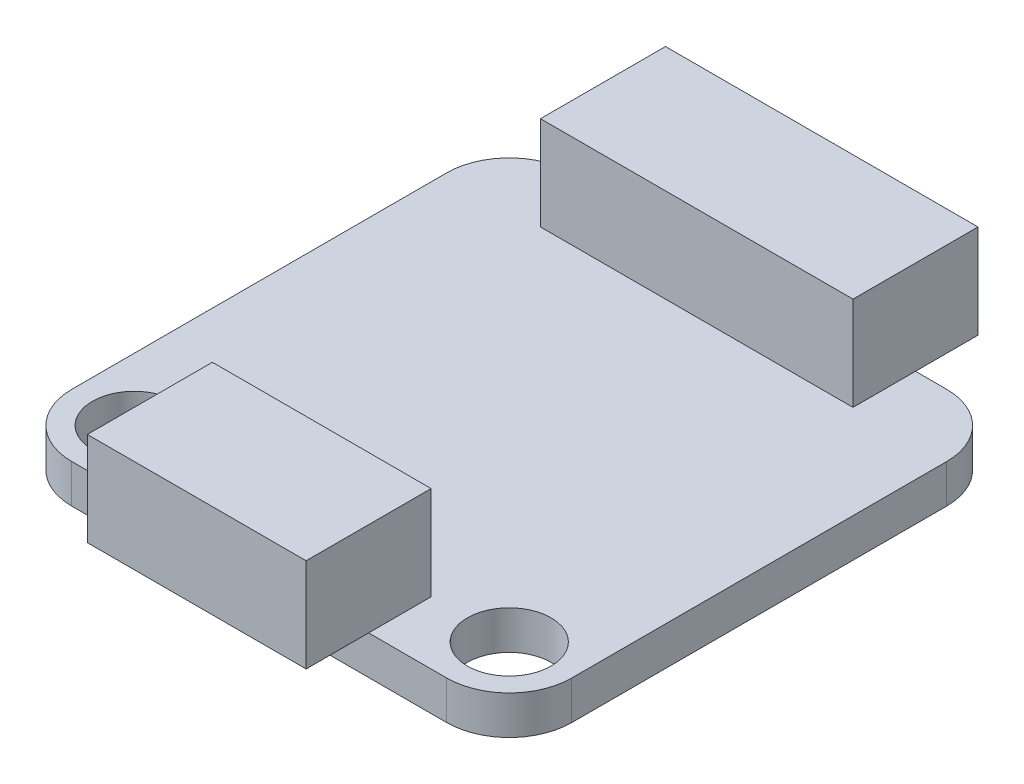
ISO-10303-21;
HEADER;
FILE_DESCRIPTION(('STEP AP214'),'2;1');
FILE_NAME('part.step','',(''),(''),'','','');
FILE_SCHEMA(('AUTOMOTIVE_DESIGN { 1 0 10303 214 1 1 1 1 }'));
ENDSEC;
DATA;
#1=APPLICATION_CONTEXT('core data for automotive mechanical design processes');
#2=APPLICATION_PROTOCOL_DEFINITION('international standard','automotive_design',2000,#1);
#3=PRODUCT_CONTEXT('',#1,'mechanical');
#4=PRODUCT('Part','Part','',(#3));
#5=PRODUCT_RELATED_PRODUCT_CATEGORY('part','',(#4));
#6=PRODUCT_DEFINITION_FORMATION('','',#4);
#7=PRODUCT_DEFINITION_CONTEXT('part definition',#1,'design');
#8=PRODUCT_DEFINITION('design','',#6,#7);
#9=PRODUCT_DEFINITION_SHAPE('','',#8);
#10=(LENGTH_UNIT() NAMED_UNIT(*) SI_UNIT(.MILLI.,.METRE.));
#11=(NAMED_UNIT(*) PLANE_ANGLE_UNIT() SI_UNIT($,.RADIAN.));
#12=(NAMED_UNIT(*) SI_UNIT($,.STERADIAN.) SOLID_ANGLE_UNIT());
#13=UNCERTAINTY_MEASURE_WITH_UNIT(LENGTH_MEASURE(1.E-05),#10,'distance_accuracy_value','');
#14=(GEOMETRIC_REPRESENTATION_CONTEXT(3) GLOBAL_UNCERTAINTY_ASSIGNED_CONTEXT((#13)) GLOBAL_UNIT_ASSIGNED_CONTEXT((#10,
#11,#12)) REPRESENTATION_CONTEXT('',''));
#15=CARTESIAN_POINT('',(0.,0.,0.));
#16=DIRECTION('',(0.,0.,1.));
#17=DIRECTION('',(1.,0.,0.));
#18=AXIS2_PLACEMENT_3D('',#15,#16,#17);
#19=CARTESIAN_POINT('',(6.35,5.38,-7.62));
#20=DIRECTION('',(-1.,0.,0.));
#21=DIRECTION('',(0.,0.,1.));
#22=AXIS2_PLACEMENT_3D('',#19,#20,#21);
#23=PLANE('',#22);
#24=DIRECTION('',(0.,0.,-1.));
#25=VECTOR('',#24,1.);
#26=CARTESIAN_POINT('',(6.35,1.57,-7.62));
#27=LINE('',#26,#25);
#28=CARTESIAN_POINT('',(6.35,1.57,-7.62));
#29=VERTEX_POINT('',#28);
#30=CARTESIAN_POINT('',(6.35,1.57,-12.7));
#31=VERTEX_POINT('',#30);
#32=EDGE_CURVE('E12',#29,#31,#27,.T.);
#33=ORIENTED_EDGE('',*,*,#32,.T.);
#34=DIRECTION('',(0.,-1.,0.));
#35=VECTOR('',#34,1.);
#36=CARTESIAN_POINT('',(6.35,5.38,-12.7));
#37=LINE('',#36,#35);
#38=CARTESIAN_POINT('',(6.35,5.38,-12.7));
#39=VERTEX_POINT('',#38);
#40=EDGE_CURVE('E125',#39,#31,#37,.T.);
#41=ORIENTED_EDGE('',*,*,#40,.F.);
#42=DIRECTION('',(0.,0.,-1.));
#43=VECTOR('',#42,1.);
#44=CARTESIAN_POINT('',(6.35,5.38,-7.62));
#45=LINE('',#44,#43);
#46=CARTESIAN_POINT('',(6.35,5.38,-7.62));
#47=VERTEX_POINT('',#46);
#48=EDGE_CURVE('E58',#47,#39,#45,.T.);
#49=ORIENTED_EDGE('',*,*,#48,.F.);
#50=DIRECTION('',(0.,-1.,0.));
#51=VECTOR('',#50,1.);
#52=CARTESIAN_POINT('',(6.35,5.38,-7.62));
#53=LINE('',#52,#51);
#54=EDGE_CURVE('E113',#47,#29,#53,.T.);
#55=ORIENTED_EDGE('',*,*,#54,.T.);
#56=EDGE_LOOP('',(#33,#41,#49,#55));
#57=FACE_BOUND('',#56,.T.);
#58=ADVANCED_FACE('F54',(#57),#23,.F.);
#59=CARTESIAN_POINT('',(-6.35,5.38,-12.7));
#60=DIRECTION('',(0.,0.,1.));
#61=DIRECTION('',(1.,0.,0.));
#62=AXIS2_PLACEMENT_3D('',#59,#60,#61);
#63=PLANE('',#62);
#64=DIRECTION('',(-1.,0.,0.));
#65=VECTOR('',#64,1.);
#66=CARTESIAN_POINT('',(-6.35,1.57,-12.7));
#67=LINE('',#66,#65);
#68=CARTESIAN_POINT('',(-6.35,1.57,-12.7));
#69=VERTEX_POINT('',#68);
#70=EDGE_CURVE('E64',#31,#69,#67,.T.);
#71=ORIENTED_EDGE('',*,*,#70,.T.);
#72=DIRECTION('',(0.,-1.,0.));
#73=VECTOR('',#72,1.);
#74=CARTESIAN_POINT('',(-6.35,5.38,-12.7));
#75=LINE('',#74,#73);
#76=CARTESIAN_POINT('',(-6.35,5.38,-12.7));
#77=VERTEX_POINT('',#76);
#78=EDGE_CURVE('E109',#77,#69,#75,.T.);
#79=ORIENTED_EDGE('',*,*,#78,.F.);
#80=DIRECTION('',(-1.,0.,0.));
#81=VECTOR('',#80,1.);
#82=CARTESIAN_POINT('',(-6.35,5.38,-12.7));
#83=LINE('',#82,#81);
#84=EDGE_CURVE('E88',#39,#77,#83,.T.);
#85=ORIENTED_EDGE('',*,*,#84,.F.);
#86=ORIENTED_EDGE('',*,*,#40,.T.);
#87=EDGE_LOOP('',(#71,#79,#85,#86));
#88=FACE_BOUND('',#87,.T.);
#89=ADVANCED_FACE('F128',(#88),#63,.F.);
#90=CARTESIAN_POINT('',(-6.35,5.38,-7.62));
#91=DIRECTION('',(1.,0.,0.));
#92=DIRECTION('',(0.,0.,-1.));
#93=AXIS2_PLACEMENT_3D('',#90,#91,#92);
#94=PLANE('',#93);
#95=DIRECTION('',(0.,0.,1.));
#96=VECTOR('',#95,1.);
#97=CARTESIAN_POINT('',(-6.35,1.57,-7.62));
#98=LINE('',#97,#96);
#99=CARTESIAN_POINT('',(-6.35,1.57,-7.62));
#100=VERTEX_POINT('',#99);
#101=EDGE_CURVE('E104',#69,#100,#98,.T.);
#102=ORIENTED_EDGE('',*,*,#101,.T.);
#103=DIRECTION('',(0.,-1.,0.));
#104=VECTOR('',#103,1.);
#105=CARTESIAN_POINT('',(-6.35,5.38,-7.62));
#106=LINE('',#105,#104);
#107=CARTESIAN_POINT('',(-6.35,5.38,-7.62));
#108=VERTEX_POINT('',#107);
#109=EDGE_CURVE('E107',#108,#100,#106,.T.);
#110=ORIENTED_EDGE('',*,*,#109,.F.);
#111=DIRECTION('',(0.,0.,1.));
#112=VECTOR('',#111,1.);
#113=CARTESIAN_POINT('',(-6.35,5.38,-7.62));
#114=LINE('',#113,#112);
#115=EDGE_CURVE('E121',#77,#108,#114,.T.);
#116=ORIENTED_EDGE('',*,*,#115,.F.);
#117=ORIENTED_EDGE('',*,*,#78,.T.);
#118=EDGE_LOOP('',(#102,#110,#116,#117));
#119=FACE_BOUND('',#118,.T.);
#120=ADVANCED_FACE('F105',(#119),#94,.F.);
#121=CARTESIAN_POINT('',(-6.35,5.38,-7.62));
#122=DIRECTION('',(0.,0.,-1.));
#123=DIRECTION('',(-1.,0.,0.));
#124=AXIS2_PLACEMENT_3D('',#121,#122,#123);
#125=PLANE('',#124);
#126=DIRECTION('',(1.,0.,0.));
#127=VECTOR('',#126,1.);
#128=CARTESIAN_POINT('',(-6.35,1.57,-7.62));
#129=LINE('',#128,#127);
#130=EDGE_CURVE('E98',#100,#29,#129,.T.);
#131=ORIENTED_EDGE('',*,*,#130,.T.);
#132=ORIENTED_EDGE('',*,*,#54,.F.);
#133=DIRECTION('',(1.,0.,0.));
#134=VECTOR('',#133,1.);
#135=CARTESIAN_POINT('',(-6.35,5.38,-7.62));
#136=LINE('',#135,#134);
#137=EDGE_CURVE('E112',#108,#47,#136,.T.);
#138=ORIENTED_EDGE('',*,*,#137,.F.);
#139=ORIENTED_EDGE('',*,*,#109,.T.);
#140=EDGE_LOOP('',(#131,#132,#138,#139));
#141=FACE_BOUND('',#140,.T.);
#142=ADVANCED_FACE('F111',(#141),#125,.F.);
#143=CARTESIAN_POINT('',(0.,5.38,0.));
#144=DIRECTION('',(0.,-1.,0.));
#145=DIRECTION('',(0.,0.,-1.));
#146=AXIS2_PLACEMENT_3D('',#143,#144,#145);
#147=PLANE('',#146);
#148=ORIENTED_EDGE('',*,*,#48,.T.);
#149=ORIENTED_EDGE('',*,*,#84,.T.);
#150=ORIENTED_EDGE('',*,*,#115,.T.);
#151=ORIENTED_EDGE('',*,*,#137,.T.);
#152=EDGE_LOOP('',(#148,#149,#150,#151));
#153=FACE_BOUND('',#152,.T.);
#154=ADVANCED_FACE('F56',(#153),#147,.F.);
#155=CARTESIAN_POINT('',(0.,1.57,0.));
#156=DIRECTION('',(0.,-1.,0.));
#157=DIRECTION('',(0.,0.,-1.));
#158=AXIS2_PLACEMENT_3D('',#155,#156,#157);
#159=PLANE('',#158);
#160=ORIENTED_EDGE('',*,*,#32,.F.);
#161=ORIENTED_EDGE('',*,*,#130,.F.);
#162=ORIENTED_EDGE('',*,*,#101,.F.);
#163=ORIENTED_EDGE('',*,*,#70,.F.);
#164=EDGE_LOOP('',(#160,#161,#162,#163));
#165=FACE_BOUND('',#164,.T.);
#166=ADVANCED_FACE('F115',(#165),#159,.T.);
#167=CLOSED_SHELL('',(#58,#89,#120,#142,#154,#166));
#168=MANIFOLD_SOLID_BREP('B2',#167);
#169=CARTESIAN_POINT('',(4.445,5.38,7.62));
#170=DIRECTION('',(-1.,0.,0.));
#171=DIRECTION('',(0.,0.,1.));
#172=AXIS2_PLACEMENT_3D('',#169,#170,#171);
#173=PLANE('',#172);
#174=DIRECTION('',(0.,0.,-1.));
#175=VECTOR('',#174,1.);
#176=CARTESIAN_POINT('',(4.445,1.57,7.62));
#177=LINE('',#176,#175);
#178=CARTESIAN_POINT('',(4.445,1.57,12.7));
#179=VERTEX_POINT('',#178);
#180=CARTESIAN_POINT('',(4.445,1.57,7.62));
#181=VERTEX_POINT('',#180);
#182=EDGE_CURVE('E250',#179,#181,#177,.T.);
#183=ORIENTED_EDGE('',*,*,#182,.T.);
#184=DIRECTION('',(0.,-1.,0.));
#185=VECTOR('',#184,1.);
#186=CARTESIAN_POINT('',(4.445,5.38,7.62));
#187=LINE('',#186,#185);
#188=CARTESIAN_POINT('',(4.445,5.38,7.62));
#189=VERTEX_POINT('',#188);
#190=EDGE_CURVE('E52',#189,#181,#187,.T.);
#191=ORIENTED_EDGE('',*,*,#190,.F.);
#192=DIRECTION('',(0.,0.,-1.));
#193=VECTOR('',#192,1.);
#194=CARTESIAN_POINT('',(4.445,5.38,7.62));
#195=LINE('',#194,#193);
#196=CARTESIAN_POINT('',(4.445,5.38,12.7));
#197=VERTEX_POINT('',#196);
#198=EDGE_CURVE('E238',#197,#189,#195,.T.);
#199=ORIENTED_EDGE('',*,*,#198,.F.);
#200=DIRECTION('',(0.,-1.,0.));
#201=VECTOR('',#200,1.);
#202=CARTESIAN_POINT('',(4.445,5.38,12.7));
#203=LINE('',#202,#201);
#204=EDGE_CURVE('E246',#197,#179,#203,.T.);
#205=ORIENTED_EDGE('',*,*,#204,.T.);
#206=EDGE_LOOP('',(#183,#191,#199,#205));
#207=FACE_BOUND('',#206,.T.);
#208=ADVANCED_FACE('F187',(#207),#173,.F.);
#209=CARTESIAN_POINT('',(-4.445,5.38,7.62));
#210=DIRECTION('',(0.,0.,1.));
#211=DIRECTION('',(1.,0.,0.));
#212=AXIS2_PLACEMENT_3D('',#209,#210,#211);
#213=PLANE('',#212);
#214=DIRECTION('',(-1.,0.,0.));
#215=VECTOR('',#214,1.);
#216=CARTESIAN_POINT('',(-4.445,1.57,7.62));
#217=LINE('',#216,#215);
#218=CARTESIAN_POINT('',(-4.445,1.57,7.62));
#219=VERTEX_POINT('',#218);
#220=EDGE_CURVE('E242',#181,#219,#217,.T.);
#221=ORIENTED_EDGE('',*,*,#220,.T.);
#222=DIRECTION('',(0.,-1.,0.));
#223=VECTOR('',#222,1.);
#224=CARTESIAN_POINT('',(-4.445,5.38,7.62));
#225=LINE('',#224,#223);
#226=CARTESIAN_POINT('',(-4.445,5.38,7.62));
#227=VERTEX_POINT('',#226);
#228=EDGE_CURVE('E195',#227,#219,#225,.T.);
#229=ORIENTED_EDGE('',*,*,#228,.F.);
#230=DIRECTION('',(-1.,0.,0.));
#231=VECTOR('',#230,1.);
#232=CARTESIAN_POINT('',(-4.445,5.38,7.62));
#233=LINE('',#232,#231);
#234=EDGE_CURVE('E233',#189,#227,#233,.T.);
#235=ORIENTED_EDGE('',*,*,#234,.F.);
#236=ORIENTED_EDGE('',*,*,#190,.T.);
#237=EDGE_LOOP('',(#221,#229,#235,#236));
#238=FACE_BOUND('',#237,.T.);
#239=ADVANCED_FACE('F241',(#238),#213,.F.);
#240=CARTESIAN_POINT('',(-4.445,5.38,7.62));
#241=DIRECTION('',(1.,0.,0.));
#242=DIRECTION('',(0.,0.,-1.));
#243=AXIS2_PLACEMENT_3D('',#240,#241,#242);
#244=PLANE('',#243);
#245=DIRECTION('',(0.,0.,1.));
#246=VECTOR('',#245,1.);
#247=CARTESIAN_POINT('',(-4.445,1.57,7.62));
#248=LINE('',#247,#246);
#249=CARTESIAN_POINT('',(-4.44499999999999,1.57,12.7));
#250=VERTEX_POINT('',#249);
#251=EDGE_CURVE('E220',#219,#250,#248,.T.);
#252=ORIENTED_EDGE('',*,*,#251,.T.);
#253=DIRECTION('',(0.,-1.,0.));
#254=VECTOR('',#253,1.);
#255=CARTESIAN_POINT('',(-4.44499999999999,5.38,12.7));
#256=LINE('',#255,#254);
#257=CARTESIAN_POINT('',(-4.44499999999999,5.38,12.7));
#258=VERTEX_POINT('',#257);
#259=EDGE_CURVE('E243',#258,#250,#256,.T.);
#260=ORIENTED_EDGE('',*,*,#259,.F.);
#261=DIRECTION('',(0.,0.,1.));
#262=VECTOR('',#261,1.);
#263=CARTESIAN_POINT('',(-4.445,5.38,7.62));
#264=LINE('',#263,#262);
#265=EDGE_CURVE('E236',#227,#258,#264,.T.);
#266=ORIENTED_EDGE('',*,*,#265,.F.);
#267=ORIENTED_EDGE('',*,*,#228,.T.);
#268=EDGE_LOOP('',(#252,#260,#266,#267));
#269=FACE_BOUND('',#268,.T.);
#270=ADVANCED_FACE('F244',(#269),#244,.F.);
#271=CARTESIAN_POINT('',(-4.44499999999999,5.38,12.7));
#272=DIRECTION('',(0.,0.,-1.));
#273=DIRECTION('',(-1.,0.,0.));
#274=AXIS2_PLACEMENT_3D('',#271,#272,#273);
#275=PLANE('',#274);
#276=DIRECTION('',(1.,0.,0.));
#277=VECTOR('',#276,1.);
#278=CARTESIAN_POINT('',(-4.44499999999999,1.57,12.7));
#279=LINE('',#278,#277);
#280=EDGE_CURVE('E226',#250,#179,#279,.T.);
#281=ORIENTED_EDGE('',*,*,#280,.T.);
#282=ORIENTED_EDGE('',*,*,#204,.F.);
#283=DIRECTION('',(1.,0.,0.));
#284=VECTOR('',#283,1.);
#285=CARTESIAN_POINT('',(-4.44499999999999,5.38,12.7));
#286=LINE('',#285,#284);
#287=EDGE_CURVE('E203',#258,#197,#286,.T.);
#288=ORIENTED_EDGE('',*,*,#287,.F.);
#289=ORIENTED_EDGE('',*,*,#259,.T.);
#290=EDGE_LOOP('',(#281,#282,#288,#289));
#291=FACE_BOUND('',#290,.T.);
#292=ADVANCED_FACE('F257',(#291),#275,.F.);
#293=CARTESIAN_POINT('',(0.,5.38,0.));
#294=DIRECTION('',(0.,1.,0.));
#295=DIRECTION('',(0.,0.,1.));
#296=AXIS2_PLACEMENT_3D('',#293,#294,#295);
#297=PLANE('',#296);
#298=ORIENTED_EDGE('',*,*,#198,.T.);
#299=ORIENTED_EDGE('',*,*,#234,.T.);
#300=ORIENTED_EDGE('',*,*,#265,.T.);
#301=ORIENTED_EDGE('',*,*,#287,.T.);
#302=EDGE_LOOP('',(#298,#299,#300,#301));
#303=FACE_BOUND('',#302,.T.);
#304=ADVANCED_FACE('F234',(#303),#297,.T.);
#305=CARTESIAN_POINT('',(0.,1.57,0.));
#306=DIRECTION('',(0.,1.,0.));
#307=DIRECTION('',(0.,0.,1.));
#308=AXIS2_PLACEMENT_3D('',#305,#306,#307);
#309=PLANE('',#308);
#310=ORIENTED_EDGE('',*,*,#182,.F.);
#311=ORIENTED_EDGE('',*,*,#280,.F.);
#312=ORIENTED_EDGE('',*,*,#251,.F.);
#313=ORIENTED_EDGE('',*,*,#220,.F.);
#314=EDGE_LOOP('',(#310,#311,#312,#313));
#315=FACE_BOUND('',#314,.T.);
#316=ADVANCED_FACE('F260',(#315),#309,.F.);
#317=CLOSED_SHELL('',(#208,#239,#270,#292,#304,#316));
#318=MANIFOLD_SOLID_BREP('B6',#317);
#319=CARTESIAN_POINT('',(0.,1.57,0.));
#320=DIRECTION('',(0.,-1.,0.));
#321=DIRECTION('',(0.,0.,-1.));
#322=AXIS2_PLACEMENT_3D('',#319,#320,#321);
#323=PLANE('',#322);
#324=CARTESIAN_POINT('',(-7.61999999999999,1.57,7.62));
#325=DIRECTION('',(0.,1.,0.));
#326=DIRECTION('',(0.,0.,1.));
#327=AXIS2_PLACEMENT_3D('',#324,#325,#326);
#328=CIRCLE('',#327,1.7);
#329=CARTESIAN_POINT('',(-7.61999999999999,1.57,9.32));
#330=VERTEX_POINT('',#329);
#331=EDGE_CURVE('E464',#330,#330,#328,.T.);
#332=ORIENTED_EDGE('',*,*,#331,.F.);
#333=EDGE_LOOP('',(#332));
#334=FACE_BOUND('',#333,.T.);
#335=DIRECTION('',(-1.,0.,0.));
#336=VECTOR('',#335,1.);
#337=CARTESIAN_POINT('',(-10.16,1.57,-10.16));
#338=LINE('',#337,#336);
#339=CARTESIAN_POINT('',(7.62,1.57,-10.16));
#340=VERTEX_POINT('',#339);
#341=CARTESIAN_POINT('',(-7.61999999999999,1.57,-10.16));
#342=VERTEX_POINT('',#341);
#343=EDGE_CURVE('E447',#340,#342,#338,.T.);
#344=ORIENTED_EDGE('',*,*,#343,.T.);
#345=CARTESIAN_POINT('',(-7.61999999999999,1.57,-7.62));
#346=DIRECTION('',(0.,-1.,0.));
#347=DIRECTION('',(0.,0.,-1.));
#348=AXIS2_PLACEMENT_3D('',#345,#346,#347);
#349=CIRCLE('',#348,2.54);
#350=CARTESIAN_POINT('',(-10.16,1.57,-7.62));
#351=VERTEX_POINT('',#350);
#352=EDGE_CURVE('E425',#342,#351,#349,.F.);
#353=ORIENTED_EDGE('',*,*,#352,.T.);
#354=DIRECTION('',(0.,0.,1.));
#355=VECTOR('',#354,1.);
#356=CARTESIAN_POINT('',(-10.16,1.57,10.16));
#357=LINE('',#356,#355);
#358=CARTESIAN_POINT('',(-10.16,1.57,7.62));
#359=VERTEX_POINT('',#358);
#360=EDGE_CURVE('E395',#351,#359,#357,.T.);
#361=ORIENTED_EDGE('',*,*,#360,.T.);
#362=CARTESIAN_POINT('',(-7.61999999999999,1.57,7.62));
#363=DIRECTION('',(0.,-1.,0.));
#364=DIRECTION('',(0.,0.,-1.));
#365=AXIS2_PLACEMENT_3D('',#362,#363,#364);
#366=CIRCLE('',#365,2.54);
#367=CARTESIAN_POINT('',(-7.62,1.57,10.16));
#368=VERTEX_POINT('',#367);
#369=EDGE_CURVE('E331',#359,#368,#366,.F.);
#370=ORIENTED_EDGE('',*,*,#369,.T.);
#371=DIRECTION('',(1.,0.,0.));
#372=VECTOR('',#371,1.);
#373=CARTESIAN_POINT('',(-10.16,1.57,10.16));
#374=LINE('',#373,#372);
#375=CARTESIAN_POINT('',(7.62,1.57,10.16));
#376=VERTEX_POINT('',#375);
#377=EDGE_CURVE('E411',#368,#376,#374,.T.);
#378=ORIENTED_EDGE('',*,*,#377,.T.);
#379=CARTESIAN_POINT('',(7.62,1.57,7.62));
#380=DIRECTION('',(0.,-1.,0.));
#381=DIRECTION('',(0.,0.,-1.));
#382=AXIS2_PLACEMENT_3D('',#379,#380,#381);
#383=CIRCLE('',#382,2.54);
#384=CARTESIAN_POINT('',(10.16,1.57,7.62));
#385=VERTEX_POINT('',#384);
#386=EDGE_CURVE('E421',#376,#385,#383,.F.);
#387=ORIENTED_EDGE('',*,*,#386,.T.);
#388=DIRECTION('',(0.,0.,-1.));
#389=VECTOR('',#388,1.);
#390=CARTESIAN_POINT('',(10.16,1.57,10.16));
#391=LINE('',#390,#389);
#392=CARTESIAN_POINT('',(10.16,1.57,-7.62));
#393=VERTEX_POINT('',#392);
#394=EDGE_CURVE('E405',#385,#393,#391,.T.);
#395=ORIENTED_EDGE('',*,*,#394,.T.);
#396=CARTESIAN_POINT('',(7.62,1.57,-7.62));
#397=DIRECTION('',(0.,-1.,0.));
#398=DIRECTION('',(0.,0.,-1.));
#399=AXIS2_PLACEMENT_3D('',#396,#397,#398);
#400=CIRCLE('',#399,2.54);
#401=EDGE_CURVE('E423',#393,#340,#400,.F.);
#402=ORIENTED_EDGE('',*,*,#401,.T.);
#403=EDGE_LOOP('',(#344,#353,#361,#370,#378,#387,#395,#402));
#404=FACE_BOUND('',#403,.T.);
#405=CARTESIAN_POINT('',(7.62,1.57,7.62));
#406=DIRECTION('',(0.,1.,0.));
#407=DIRECTION('',(0.,0.,1.));
#408=AXIS2_PLACEMENT_3D('',#405,#406,#407);
#409=CIRCLE('',#408,1.7);
#410=CARTESIAN_POINT('',(7.62,1.57,9.32));
#411=VERTEX_POINT('',#410);
#412=EDGE_CURVE('E457',#411,#411,#409,.T.);
#413=ORIENTED_EDGE('',*,*,#412,.F.);
#414=EDGE_LOOP('',(#413));
#415=FACE_BOUND('',#414,.T.);
#416=ADVANCED_FACE('F311',(#334,#404,#415),#323,.F.);
#417=CARTESIAN_POINT('',(0.,0.,0.));
#418=DIRECTION('',(0.,-1.,0.));
#419=DIRECTION('',(0.,0.,-1.));
#420=AXIS2_PLACEMENT_3D('',#417,#418,#419);
#421=PLANE('',#420);
#422=CARTESIAN_POINT('',(-7.61999999999999,0.,7.62));
#423=DIRECTION('',(0.,1.,0.));
#424=DIRECTION('',(0.,0.,1.));
#425=AXIS2_PLACEMENT_3D('',#422,#423,#424);
#426=CIRCLE('',#425,1.7);
#427=CARTESIAN_POINT('',(-7.61999999999999,0.,9.32));
#428=VERTEX_POINT('',#427);
#429=EDGE_CURVE('E460',#428,#428,#426,.T.);
#430=ORIENTED_EDGE('',*,*,#429,.T.);
#431=EDGE_LOOP('',(#430));
#432=FACE_BOUND('',#431,.T.);
#433=DIRECTION('',(0.,0.,1.));
#434=VECTOR('',#433,1.);
#435=CARTESIAN_POINT('',(-10.16,0.,10.16));
#436=LINE('',#435,#434);
#437=CARTESIAN_POINT('',(-10.16,0.,-7.62));
#438=VERTEX_POINT('',#437);
#439=CARTESIAN_POINT('',(-10.16,0.,7.62));
#440=VERTEX_POINT('',#439);
#441=EDGE_CURVE('E393',#438,#440,#436,.T.);
#442=ORIENTED_EDGE('',*,*,#441,.F.);
#443=CARTESIAN_POINT('',(-7.61999999999999,0.,-7.62));
#444=DIRECTION('',(0.,-1.,0.));
#445=DIRECTION('',(0.,0.,-1.));
#446=AXIS2_PLACEMENT_3D('',#443,#444,#445);
#447=CIRCLE('',#446,2.54);
#448=CARTESIAN_POINT('',(-7.61999999999999,0.,-10.16));
#449=VERTEX_POINT('',#448);
#450=EDGE_CURVE('E376',#438,#449,#447,.T.);
#451=ORIENTED_EDGE('',*,*,#450,.T.);
#452=DIRECTION('',(-1.,0.,0.));
#453=VECTOR('',#452,1.);
#454=CARTESIAN_POINT('',(-10.16,0.,-10.16));
#455=LINE('',#454,#453);
#456=CARTESIAN_POINT('',(7.62,0.,-10.16));
#457=VERTEX_POINT('',#456);
#458=EDGE_CURVE('E403',#457,#449,#455,.T.);
#459=ORIENTED_EDGE('',*,*,#458,.F.);
#460=CARTESIAN_POINT('',(7.62,0.,-7.62));
#461=DIRECTION('',(0.,-1.,0.));
#462=DIRECTION('',(0.,0.,-1.));
#463=AXIS2_PLACEMENT_3D('',#460,#461,#462);
#464=CIRCLE('',#463,2.54);
#465=CARTESIAN_POINT('',(10.16,0.,-7.62));
#466=VERTEX_POINT('',#465);
#467=EDGE_CURVE('E387',#457,#466,#464,.T.);
#468=ORIENTED_EDGE('',*,*,#467,.T.);
#469=DIRECTION('',(0.,0.,-1.));
#470=VECTOR('',#469,1.);
#471=CARTESIAN_POINT('',(10.16,0.,10.16));
#472=LINE('',#471,#470);
#473=CARTESIAN_POINT('',(10.16,0.,7.62));
#474=VERTEX_POINT('',#473);
#475=EDGE_CURVE('E407',#474,#466,#472,.T.);
#476=ORIENTED_EDGE('',*,*,#475,.F.);
#477=CARTESIAN_POINT('',(7.62,0.,7.62));
#478=DIRECTION('',(0.,-1.,0.));
#479=DIRECTION('',(0.,0.,-1.));
#480=AXIS2_PLACEMENT_3D('',#477,#478,#479);
#481=CIRCLE('',#480,2.54);
#482=CARTESIAN_POINT('',(7.62,0.,10.16));
#483=VERTEX_POINT('',#482);
#484=EDGE_CURVE('E414',#474,#483,#481,.T.);
#485=ORIENTED_EDGE('',*,*,#484,.T.);
#486=DIRECTION('',(1.,0.,0.));
#487=VECTOR('',#486,1.);
#488=CARTESIAN_POINT('',(-10.16,0.,10.16));
#489=LINE('',#488,#487);
#490=CARTESIAN_POINT('',(-7.62,0.,10.16));
#491=VERTEX_POINT('',#490);
#492=EDGE_CURVE('E402',#491,#483,#489,.T.);
#493=ORIENTED_EDGE('',*,*,#492,.F.);
#494=CARTESIAN_POINT('',(-7.61999999999999,0.,7.62));
#495=DIRECTION('',(0.,-1.,0.));
#496=DIRECTION('',(0.,0.,-1.));
#497=AXIS2_PLACEMENT_3D('',#494,#495,#496);
#498=CIRCLE('',#497,2.54);
#499=EDGE_CURVE('E396',#491,#440,#498,.T.);
#500=ORIENTED_EDGE('',*,*,#499,.T.);
#501=EDGE_LOOP('',(#442,#451,#459,#468,#476,#485,#493,#500));
#502=FACE_BOUND('',#501,.T.);
#503=CARTESIAN_POINT('',(7.62,0.,7.62));
#504=DIRECTION('',(0.,1.,0.));
#505=DIRECTION('',(0.,0.,1.));
#506=AXIS2_PLACEMENT_3D('',#503,#504,#505);
#507=CIRCLE('',#506,1.7);
#508=CARTESIAN_POINT('',(7.62,0.,9.32));
#509=VERTEX_POINT('',#508);
#510=EDGE_CURVE('E452',#509,#509,#507,.T.);
#511=ORIENTED_EDGE('',*,*,#510,.T.);
#512=EDGE_LOOP('',(#511));
#513=FACE_BOUND('',#512,.T.);
#514=ADVANCED_FACE('F399',(#432,#502,#513),#421,.T.);
#515=CARTESIAN_POINT('',(10.16,1.57,10.16));
#516=DIRECTION('',(-1.,0.,0.));
#517=DIRECTION('',(0.,0.,1.));
#518=AXIS2_PLACEMENT_3D('',#515,#516,#517);
#519=PLANE('',#518);
#520=ORIENTED_EDGE('',*,*,#475,.T.);
#521=DIRECTION('',(0.,-1.,0.));
#522=VECTOR('',#521,1.);
#523=CARTESIAN_POINT('',(10.16,1.57,-7.62));
#524=LINE('',#523,#522);
#525=EDGE_CURVE('E430',#466,#393,#524,.F.);
#526=ORIENTED_EDGE('',*,*,#525,.T.);
#527=ORIENTED_EDGE('',*,*,#394,.F.);
#528=DIRECTION('',(0.,-1.,0.));
#529=VECTOR('',#528,1.);
#530=CARTESIAN_POINT('',(10.16,1.57,7.62));
#531=LINE('',#530,#529);
#532=EDGE_CURVE('E427',#385,#474,#531,.T.);
#533=ORIENTED_EDGE('',*,*,#532,.T.);
#534=EDGE_LOOP('',(#520,#526,#527,#533));
#535=FACE_BOUND('',#534,.T.);
#536=ADVANCED_FACE('F443',(#535),#519,.F.);
#537=CARTESIAN_POINT('',(-10.16,1.57,-10.16));
#538=DIRECTION('',(0.,0.,1.));
#539=DIRECTION('',(1.,0.,0.));
#540=AXIS2_PLACEMENT_3D('',#537,#538,#539);
#541=PLANE('',#540);
#542=ORIENTED_EDGE('',*,*,#458,.T.);
#543=DIRECTION('',(0.,-1.,0.));
#544=VECTOR('',#543,1.);
#545=CARTESIAN_POINT('',(-7.61999999999999,1.57,-10.16));
#546=LINE('',#545,#544);
#547=EDGE_CURVE('E381',#449,#342,#546,.F.);
#548=ORIENTED_EDGE('',*,*,#547,.T.);
#549=ORIENTED_EDGE('',*,*,#343,.F.);
#550=DIRECTION('',(0.,-1.,0.));
#551=VECTOR('',#550,1.);
#552=CARTESIAN_POINT('',(7.62,1.57,-10.16));
#553=LINE('',#552,#551);
#554=EDGE_CURVE('E386',#340,#457,#553,.T.);
#555=ORIENTED_EDGE('',*,*,#554,.T.);
#556=EDGE_LOOP('',(#542,#548,#549,#555));
#557=FACE_BOUND('',#556,.T.);
#558=ADVANCED_FACE('F478',(#557),#541,.F.);
#559=CARTESIAN_POINT('',(-10.16,1.57,10.16));
#560=DIRECTION('',(1.,0.,0.));
#561=DIRECTION('',(0.,0.,-1.));
#562=AXIS2_PLACEMENT_3D('',#559,#560,#561);
#563=PLANE('',#562);
#564=ORIENTED_EDGE('',*,*,#360,.F.);
#565=DIRECTION('',(0.,-1.,0.));
#566=VECTOR('',#565,1.);
#567=CARTESIAN_POINT('',(-10.16,1.57,-7.62));
#568=LINE('',#567,#566);
#569=EDGE_CURVE('E380',#351,#438,#568,.T.);
#570=ORIENTED_EDGE('',*,*,#569,.T.);
#571=ORIENTED_EDGE('',*,*,#441,.T.);
#572=DIRECTION('',(0.,-1.,0.));
#573=VECTOR('',#572,1.);
#574=CARTESIAN_POINT('',(-10.16,1.57,7.62));
#575=LINE('',#574,#573);
#576=EDGE_CURVE('E397',#440,#359,#575,.F.);
#577=ORIENTED_EDGE('',*,*,#576,.T.);
#578=EDGE_LOOP('',(#564,#570,#571,#577));
#579=FACE_BOUND('',#578,.T.);
#580=ADVANCED_FACE('F392',(#579),#563,.F.);
#581=CARTESIAN_POINT('',(-10.16,1.57,10.16));
#582=DIRECTION('',(0.,0.,-1.));
#583=DIRECTION('',(-1.,0.,0.));
#584=AXIS2_PLACEMENT_3D('',#581,#582,#583);
#585=PLANE('',#584);
#586=ORIENTED_EDGE('',*,*,#492,.T.);
#587=DIRECTION('',(0.,-1.,0.));
#588=VECTOR('',#587,1.);
#589=CARTESIAN_POINT('',(7.62,1.57,10.16));
#590=LINE('',#589,#588);
#591=EDGE_CURVE('E185',#483,#376,#590,.F.);
#592=ORIENTED_EDGE('',*,*,#591,.T.);
#593=ORIENTED_EDGE('',*,*,#377,.F.);
#594=DIRECTION('',(0.,-1.,0.));
#595=VECTOR('',#594,1.);
#596=CARTESIAN_POINT('',(-7.62,1.57,10.16));
#597=LINE('',#596,#595);
#598=EDGE_CURVE('E319',#368,#491,#597,.T.);
#599=ORIENTED_EDGE('',*,*,#598,.T.);
#600=EDGE_LOOP('',(#586,#592,#593,#599));
#601=FACE_BOUND('',#600,.T.);
#602=ADVANCED_FACE('F433',(#601),#585,.F.);
#603=CARTESIAN_POINT('',(-7.61999999999999,1.57,-7.62));
#604=DIRECTION('',(0.,-1.,0.));
#605=DIRECTION('',(0.,0.,-1.));
#606=AXIS2_PLACEMENT_3D('',#603,#604,#605);
#607=CYLINDRICAL_SURFACE('',#606,2.54);
#608=ORIENTED_EDGE('',*,*,#352,.F.);
#609=ORIENTED_EDGE('',*,*,#547,.F.);
#610=ORIENTED_EDGE('',*,*,#450,.F.);
#611=ORIENTED_EDGE('',*,*,#569,.F.);
#612=EDGE_LOOP('',(#608,#609,#610,#611));
#613=FACE_BOUND('',#612,.T.);
#614=ADVANCED_FACE('F379',(#613),#607,.T.);
#615=CARTESIAN_POINT('',(7.62,1.57,-7.62));
#616=DIRECTION('',(0.,-1.,0.));
#617=DIRECTION('',(0.,0.,-1.));
#618=AXIS2_PLACEMENT_3D('',#615,#616,#617);
#619=CYLINDRICAL_SURFACE('',#618,2.54);
#620=ORIENTED_EDGE('',*,*,#401,.F.);
#621=ORIENTED_EDGE('',*,*,#525,.F.);
#622=ORIENTED_EDGE('',*,*,#467,.F.);
#623=ORIENTED_EDGE('',*,*,#554,.F.);
#624=EDGE_LOOP('',(#620,#621,#622,#623));
#625=FACE_BOUND('',#624,.T.);
#626=ADVANCED_FACE('F480',(#625),#619,.T.);
#627=CARTESIAN_POINT('',(7.62,1.57,7.62));
#628=DIRECTION('',(0.,-1.,0.));
#629=DIRECTION('',(0.,0.,-1.));
#630=AXIS2_PLACEMENT_3D('',#627,#628,#629);
#631=CYLINDRICAL_SURFACE('',#630,2.54);
#632=ORIENTED_EDGE('',*,*,#386,.F.);
#633=ORIENTED_EDGE('',*,*,#591,.F.);
#634=ORIENTED_EDGE('',*,*,#484,.F.);
#635=ORIENTED_EDGE('',*,*,#532,.F.);
#636=EDGE_LOOP('',(#632,#633,#634,#635));
#637=FACE_BOUND('',#636,.T.);
#638=ADVANCED_FACE('F440',(#637),#631,.T.);
#639=CARTESIAN_POINT('',(-7.61999999999999,1.57,7.62));
#640=DIRECTION('',(0.,-1.,0.));
#641=DIRECTION('',(0.,0.,-1.));
#642=AXIS2_PLACEMENT_3D('',#639,#640,#641);
#643=CYLINDRICAL_SURFACE('',#642,2.54);
#644=ORIENTED_EDGE('',*,*,#369,.F.);
#645=ORIENTED_EDGE('',*,*,#576,.F.);
#646=ORIENTED_EDGE('',*,*,#499,.F.);
#647=ORIENTED_EDGE('',*,*,#598,.F.);
#648=EDGE_LOOP('',(#644,#645,#646,#647));
#649=FACE_BOUND('',#648,.T.);
#650=ADVANCED_FACE('F313',(#649),#643,.T.);
#651=CARTESIAN_POINT('',(7.62,1.57,7.62));
#652=DIRECTION('',(0.,1.,0.));
#653=DIRECTION('',(0.,0.,1.));
#654=AXIS2_PLACEMENT_3D('',#651,#652,#653);
#655=CYLINDRICAL_SURFACE('',#654,1.7);
#656=ORIENTED_EDGE('',*,*,#510,.F.);
#657=EDGE_LOOP('',(#656));
#658=FACE_BOUND('',#657,.T.);
#659=ORIENTED_EDGE('',*,*,#412,.T.);
#660=EDGE_LOOP('',(#659));
#661=FACE_BOUND('',#660,.T.);
#662=ADVANCED_FACE('F500',(#658,#661),#655,.F.);
#663=CARTESIAN_POINT('',(-7.61999999999999,1.57,7.62));
#664=DIRECTION('',(0.,1.,0.));
#665=DIRECTION('',(0.,0.,1.));
#666=AXIS2_PLACEMENT_3D('',#663,#664,#665);
#667=CYLINDRICAL_SURFACE('',#666,1.7);
#668=ORIENTED_EDGE('',*,*,#429,.F.);
#669=EDGE_LOOP('',(#668));
#670=FACE_BOUND('',#669,.T.);
#671=ORIENTED_EDGE('',*,*,#331,.T.);
#672=EDGE_LOOP('',(#671));
#673=FACE_BOUND('',#672,.T.);
#674=ADVANCED_FACE('F470',(#670,#673),#667,.F.);
#675=CLOSED_SHELL('',(#416,#514,#536,#558,#580,#602,#614,#626,#638,#650,#662,#674));
#676=MANIFOLD_SOLID_BREP('B46',#675);
#677=ADVANCED_BREP_SHAPE_REPRESENTATION('',(#18,#168,#318,#676),#14);
#678=SHAPE_DEFINITION_REPRESENTATION(#9,#677);
ENDSEC;
END-ISO-10303-21;
